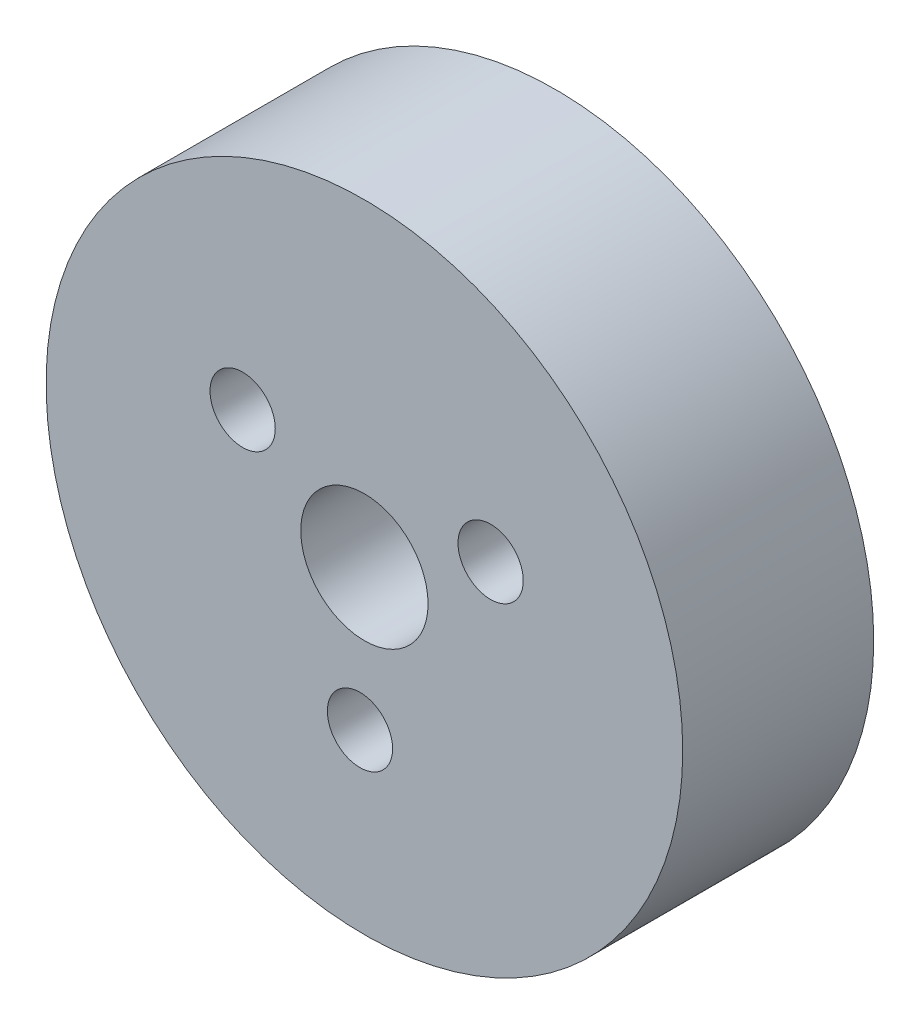
ISO-10303-21;
HEADER;
FILE_DESCRIPTION(('STEP AP214'),'2;1');
FILE_NAME('part.step','',(''),(''),'','','');
FILE_SCHEMA(('AUTOMOTIVE_DESIGN { 1 0 10303 214 1 1 1 1 }'));
ENDSEC;
DATA;
#1=APPLICATION_CONTEXT('core data for automotive mechanical design processes');
#2=APPLICATION_PROTOCOL_DEFINITION('international standard','automotive_design',2000,#1);
#3=PRODUCT_CONTEXT('',#1,'mechanical');
#4=PRODUCT('Part','Part','',(#3));
#5=PRODUCT_RELATED_PRODUCT_CATEGORY('part','',(#4));
#6=PRODUCT_DEFINITION_FORMATION('','',#4);
#7=PRODUCT_DEFINITION_CONTEXT('part definition',#1,'design');
#8=PRODUCT_DEFINITION('design','',#6,#7);
#9=PRODUCT_DEFINITION_SHAPE('','',#8);
#10=(LENGTH_UNIT() NAMED_UNIT(*) SI_UNIT(.MILLI.,.METRE.));
#11=(NAMED_UNIT(*) PLANE_ANGLE_UNIT() SI_UNIT($,.RADIAN.));
#12=(NAMED_UNIT(*) SI_UNIT($,.STERADIAN.) SOLID_ANGLE_UNIT());
#13=UNCERTAINTY_MEASURE_WITH_UNIT(LENGTH_MEASURE(1.E-05),#10,'distance_accuracy_value','');
#14=(GEOMETRIC_REPRESENTATION_CONTEXT(3) GLOBAL_UNCERTAINTY_ASSIGNED_CONTEXT((#13)) GLOBAL_UNIT_ASSIGNED_CONTEXT((#10,
#11,#12)) REPRESENTATION_CONTEXT('',''));
#15=CARTESIAN_POINT('',(0.,0.,0.));
#16=DIRECTION('',(0.,0.,1.));
#17=DIRECTION('',(1.,0.,0.));
#18=AXIS2_PLACEMENT_3D('',#15,#16,#17);
#19=CARTESIAN_POINT('',(0.,0.,6.));
#20=DIRECTION('',(0.,0.,1.));
#21=DIRECTION('',(1.,0.,0.));
#22=AXIS2_PLACEMENT_3D('',#19,#20,#21);
#23=PLANE('',#22);
#24=CARTESIAN_POINT('',(-0.139126682656782,-4.49784879316397,6.));
#25=DIRECTION('',(0.,0.,1.));
#26=DIRECTION('',(1.,0.,0.));
#27=AXIS2_PLACEMENT_3D('',#24,#25,#26);
#28=CIRCLE('',#27,1.02499999999999);
#29=CARTESIAN_POINT('',(0.885873317343207,-4.49784879316397,6.));
#30=VERTEX_POINT('',#29);
#31=EDGE_CURVE('E105',#30,#30,#28,.T.);
#32=ORIENTED_EDGE('',*,*,#31,.F.);
#33=EDGE_LOOP('',(#32));
#34=FACE_BOUND('',#33,.T.);
#35=CARTESIAN_POINT('',(-3.82568797593341,2.36941163810803,6.));
#36=DIRECTION('',(0.,0.,1.));
#37=DIRECTION('',(1.,0.,0.));
#38=AXIS2_PLACEMENT_3D('',#35,#36,#37);
#39=CIRCLE('',#38,1.02499999999999);
#40=CARTESIAN_POINT('',(-2.80068797593342,2.36941163810803,6.));
#41=VERTEX_POINT('',#40);
#42=EDGE_CURVE('E56',#41,#41,#39,.T.);
#43=ORIENTED_EDGE('',*,*,#42,.F.);
#44=EDGE_LOOP('',(#43));
#45=FACE_BOUND('',#44,.T.);
#46=CARTESIAN_POINT('',(3.96481465859017,2.12843715505803,6.));
#47=DIRECTION('',(0.,0.,1.));
#48=DIRECTION('',(1.,0.,0.));
#49=AXIS2_PLACEMENT_3D('',#46,#47,#48);
#50=CIRCLE('',#49,1.02499999999999);
#51=CARTESIAN_POINT('',(4.98981465859015,2.12843715505803,6.));
#52=VERTEX_POINT('',#51);
#53=EDGE_CURVE('E37',#52,#52,#50,.T.);
#54=ORIENTED_EDGE('',*,*,#53,.F.);
#55=EDGE_LOOP('',(#54));
#56=FACE_BOUND('',#55,.T.);
#57=CARTESIAN_POINT('',(0.,0.,6.));
#58=DIRECTION('',(0.,0.,1.));
#59=DIRECTION('',(1.,0.,0.));
#60=AXIS2_PLACEMENT_3D('',#57,#58,#59);
#61=CIRCLE('',#60,10.);
#62=CARTESIAN_POINT('',(10.,0.,6.));
#63=VERTEX_POINT('',#62);
#64=EDGE_CURVE('E11',#63,#63,#61,.T.);
#65=ORIENTED_EDGE('',*,*,#64,.T.);
#66=EDGE_LOOP('',(#65));
#67=FACE_BOUND('',#66,.T.);
#68=CARTESIAN_POINT('',(0.,0.,6.));
#69=DIRECTION('',(0.,0.,1.));
#70=DIRECTION('',(1.,0.,0.));
#71=AXIS2_PLACEMENT_3D('',#68,#69,#70);
#72=CIRCLE('',#71,2.);
#73=CARTESIAN_POINT('',(2.,0.,6.));
#74=VERTEX_POINT('',#73);
#75=EDGE_CURVE('E47',#74,#74,#72,.T.);
#76=ORIENTED_EDGE('',*,*,#75,.F.);
#77=EDGE_LOOP('',(#76));
#78=FACE_BOUND('',#77,.T.);
#79=ADVANCED_FACE('F33',(#34,#45,#56,#67,#78),#23,.T.);
#80=CARTESIAN_POINT('',(0.,0.,0.));
#81=DIRECTION('',(0.,0.,1.));
#82=DIRECTION('',(1.,0.,0.));
#83=AXIS2_PLACEMENT_3D('',#80,#81,#82);
#84=PLANE('',#83);
#85=CARTESIAN_POINT('',(-0.139126682656782,-4.49784879316397,0.));
#86=DIRECTION('',(0.,0.,1.));
#87=DIRECTION('',(1.,0.,0.));
#88=AXIS2_PLACEMENT_3D('',#85,#86,#87);
#89=CIRCLE('',#88,1.02499999999999);
#90=CARTESIAN_POINT('',(0.885873317343208,-4.49784879316397,0.));
#91=VERTEX_POINT('',#90);
#92=EDGE_CURVE('E108',#91,#91,#89,.T.);
#93=ORIENTED_EDGE('',*,*,#92,.T.);
#94=EDGE_LOOP('',(#93));
#95=FACE_BOUND('',#94,.T.);
#96=CARTESIAN_POINT('',(-3.82568797593341,2.36941163810803,0.));
#97=DIRECTION('',(0.,0.,1.));
#98=DIRECTION('',(1.,0.,0.));
#99=AXIS2_PLACEMENT_3D('',#96,#97,#98);
#100=CIRCLE('',#99,1.02499999999999);
#101=CARTESIAN_POINT('',(-2.80068797593342,2.36941163810803,0.));
#102=VERTEX_POINT('',#101);
#103=EDGE_CURVE('E62',#102,#102,#100,.T.);
#104=ORIENTED_EDGE('',*,*,#103,.T.);
#105=EDGE_LOOP('',(#104));
#106=FACE_BOUND('',#105,.T.);
#107=CARTESIAN_POINT('',(3.96481465859017,2.12843715505803,0.));
#108=DIRECTION('',(0.,0.,1.));
#109=DIRECTION('',(1.,0.,0.));
#110=AXIS2_PLACEMENT_3D('',#107,#108,#109);
#111=CIRCLE('',#110,1.02499999999999);
#112=CARTESIAN_POINT('',(4.98981465859015,2.12843715505803,0.));
#113=VERTEX_POINT('',#112);
#114=EDGE_CURVE('E61',#113,#113,#111,.T.);
#115=ORIENTED_EDGE('',*,*,#114,.T.);
#116=EDGE_LOOP('',(#115));
#117=FACE_BOUND('',#116,.T.);
#118=CARTESIAN_POINT('',(0.,0.,0.));
#119=DIRECTION('',(0.,0.,1.));
#120=DIRECTION('',(1.,0.,0.));
#121=AXIS2_PLACEMENT_3D('',#118,#119,#120);
#122=CIRCLE('',#121,10.);
#123=CARTESIAN_POINT('',(10.,0.,0.));
#124=VERTEX_POINT('',#123);
#125=EDGE_CURVE('E42',#124,#124,#122,.T.);
#126=ORIENTED_EDGE('',*,*,#125,.F.);
#127=EDGE_LOOP('',(#126));
#128=FACE_BOUND('',#127,.T.);
#129=CARTESIAN_POINT('',(0.,0.,0.));
#130=DIRECTION('',(0.,0.,1.));
#131=DIRECTION('',(1.,0.,0.));
#132=AXIS2_PLACEMENT_3D('',#129,#130,#131);
#133=CIRCLE('',#132,2.);
#134=CARTESIAN_POINT('',(2.,0.,0.));
#135=VERTEX_POINT('',#134);
#136=EDGE_CURVE('E50',#135,#135,#133,.T.);
#137=ORIENTED_EDGE('',*,*,#136,.T.);
#138=EDGE_LOOP('',(#137));
#139=FACE_BOUND('',#138,.T.);
#140=ADVANCED_FACE('F78',(#95,#106,#117,#128,#139),#84,.F.);
#141=CARTESIAN_POINT('',(0.,0.,6.));
#142=DIRECTION('',(0.,0.,-1.));
#143=DIRECTION('',(-1.,0.,0.));
#144=AXIS2_PLACEMENT_3D('',#141,#142,#143);
#145=CYLINDRICAL_SURFACE('',#144,10.);
#146=ORIENTED_EDGE('',*,*,#64,.F.);
#147=EDGE_LOOP('',(#146));
#148=FACE_BOUND('',#147,.T.);
#149=ORIENTED_EDGE('',*,*,#125,.T.);
#150=EDGE_LOOP('',(#149));
#151=FACE_BOUND('',#150,.T.);
#152=ADVANCED_FACE('F35',(#148,#151),#145,.T.);
#153=CARTESIAN_POINT('',(0.,0.,6.));
#154=DIRECTION('',(0.,0.,-1.));
#155=DIRECTION('',(-1.,0.,0.));
#156=AXIS2_PLACEMENT_3D('',#153,#154,#155);
#157=CYLINDRICAL_SURFACE('',#156,2.);
#158=ORIENTED_EDGE('',*,*,#75,.T.);
#159=EDGE_LOOP('',(#158));
#160=FACE_BOUND('',#159,.T.);
#161=ORIENTED_EDGE('',*,*,#136,.F.);
#162=EDGE_LOOP('',(#161));
#163=FACE_BOUND('',#162,.T.);
#164=ADVANCED_FACE('F89',(#160,#163),#157,.F.);
#165=CARTESIAN_POINT('',(3.96481465859017,2.12843715505803,6.73659999999072));
#166=DIRECTION('',(0.,0.,1.));
#167=DIRECTION('',(1.,0.,0.));
#168=AXIS2_PLACEMENT_3D('',#165,#166,#167);
#169=CYLINDRICAL_SURFACE('',#168,1.02499999999999);
#170=ORIENTED_EDGE('',*,*,#53,.T.);
#171=EDGE_LOOP('',(#170));
#172=FACE_BOUND('',#171,.T.);
#173=ORIENTED_EDGE('',*,*,#114,.F.);
#174=EDGE_LOOP('',(#173));
#175=FACE_BOUND('',#174,.T.);
#176=ADVANCED_FACE('F74',(#172,#175),#169,.F.);
#177=CARTESIAN_POINT('',(-3.82568797593341,2.36941163810803,6.73659999999072));
#178=DIRECTION('',(0.,0.,1.));
#179=DIRECTION('',(1.,0.,0.));
#180=AXIS2_PLACEMENT_3D('',#177,#178,#179);
#181=CYLINDRICAL_SURFACE('',#180,1.02499999999999);
#182=ORIENTED_EDGE('',*,*,#42,.T.);
#183=EDGE_LOOP('',(#182));
#184=FACE_BOUND('',#183,.T.);
#185=ORIENTED_EDGE('',*,*,#103,.F.);
#186=EDGE_LOOP('',(#185));
#187=FACE_BOUND('',#186,.T.);
#188=ADVANCED_FACE('F94',(#184,#187),#181,.F.);
#189=CARTESIAN_POINT('',(-0.139126682656782,-4.49784879316397,6.73659999999072));
#190=DIRECTION('',(0.,0.,1.));
#191=DIRECTION('',(1.,0.,0.));
#192=AXIS2_PLACEMENT_3D('',#189,#190,#191);
#193=CYLINDRICAL_SURFACE('',#192,1.02499999999999);
#194=ORIENTED_EDGE('',*,*,#31,.T.);
#195=EDGE_LOOP('',(#194));
#196=FACE_BOUND('',#195,.T.);
#197=ORIENTED_EDGE('',*,*,#92,.F.);
#198=EDGE_LOOP('',(#197));
#199=FACE_BOUND('',#198,.T.);
#200=ADVANCED_FACE('F97',(#196,#199),#193,.F.);
#201=CLOSED_SHELL('',(#79,#140,#152,#164,#176,#188,#200));
#202=MANIFOLD_SOLID_BREP('B2',#201);
#203=ADVANCED_BREP_SHAPE_REPRESENTATION('',(#18,#202),#14);
#204=SHAPE_DEFINITION_REPRESENTATION(#9,#203);
ENDSEC;
END-ISO-10303-21;
